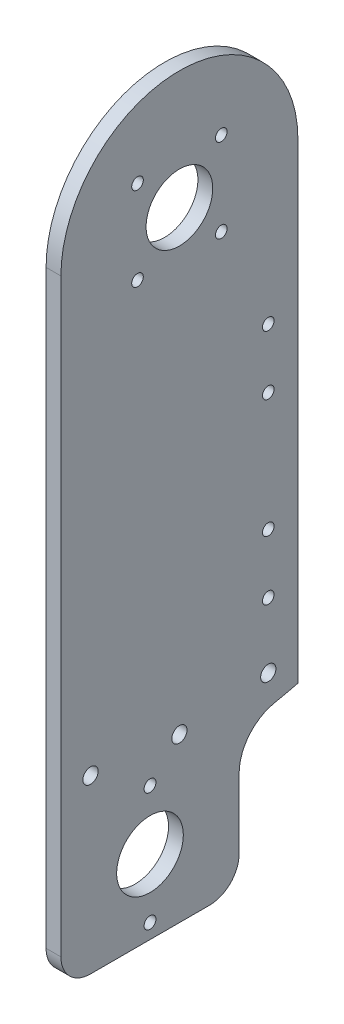
ISO-10303-21;
HEADER;
FILE_DESCRIPTION(('STEP AP214'),'2;1');
FILE_NAME('part.step','',(''),(''),'','','');
FILE_SCHEMA(('AUTOMOTIVE_DESIGN { 1 0 10303 214 1 1 1 1 }'));
ENDSEC;
DATA;
#1=APPLICATION_CONTEXT('core data for automotive mechanical design processes');
#2=APPLICATION_PROTOCOL_DEFINITION('international standard','automotive_design',2000,#1);
#3=PRODUCT_CONTEXT('',#1,'mechanical');
#4=PRODUCT('Part','Part','',(#3));
#5=PRODUCT_RELATED_PRODUCT_CATEGORY('part','',(#4));
#6=PRODUCT_DEFINITION_FORMATION('','',#4);
#7=PRODUCT_DEFINITION_CONTEXT('part definition',#1,'design');
#8=PRODUCT_DEFINITION('design','',#6,#7);
#9=PRODUCT_DEFINITION_SHAPE('','',#8);
#10=(LENGTH_UNIT() NAMED_UNIT(*) SI_UNIT(.MILLI.,.METRE.));
#11=(NAMED_UNIT(*) PLANE_ANGLE_UNIT() SI_UNIT($,.RADIAN.));
#12=(NAMED_UNIT(*) SI_UNIT($,.STERADIAN.) SOLID_ANGLE_UNIT());
#13=UNCERTAINTY_MEASURE_WITH_UNIT(LENGTH_MEASURE(1.E-05),#10,'distance_accuracy_value','');
#14=(GEOMETRIC_REPRESENTATION_CONTEXT(3) GLOBAL_UNCERTAINTY_ASSIGNED_CONTEXT((#13)) GLOBAL_UNIT_ASSIGNED_CONTEXT((#10,
#11,#12)) REPRESENTATION_CONTEXT('',''));
#15=CARTESIAN_POINT('',(0.,0.,0.));
#16=DIRECTION('',(0.,0.,1.));
#17=DIRECTION('',(1.,0.,0.));
#18=AXIS2_PLACEMENT_3D('',#15,#16,#17);
#19=CARTESIAN_POINT('',(0.,0.,0.));
#20=DIRECTION('',(-1.,0.,0.));
#21=DIRECTION('',(0.,0.,1.));
#22=AXIS2_PLACEMENT_3D('',#19,#20,#21);
#23=PLANE('',#22);
#24=CARTESIAN_POINT('',(0.,-17.9605122421383,17.9605122421383));
#25=DIRECTION('',(1.,0.,0.));
#26=DIRECTION('',(0.,0.,-1.));
#27=AXIS2_PLACEMENT_3D('',#24,#25,#26);
#28=CIRCLE('',#27,2.48919999999999);
#29=CARTESIAN_POINT('',(0.,-17.9605122421383,15.4713122421383));
#30=VERTEX_POINT('',#29);
#31=EDGE_CURVE('E306',#30,#30,#28,.T.);
#32=ORIENTED_EDGE('',*,*,#31,.T.);
#33=EDGE_LOOP('',(#32));
#34=FACE_BOUND('',#33,.T.);
#35=CARTESIAN_POINT('',(0.,17.9605122421383,17.9605122421383));
#36=DIRECTION('',(1.,0.,0.));
#37=DIRECTION('',(0.,0.,-1.));
#38=AXIS2_PLACEMENT_3D('',#35,#36,#37);
#39=CIRCLE('',#38,2.48919999999999);
#40=CARTESIAN_POINT('',(0.,17.9605122421383,15.4713122421383));
#41=VERTEX_POINT('',#40);
#42=EDGE_CURVE('E300',#41,#41,#39,.T.);
#43=ORIENTED_EDGE('',*,*,#42,.T.);
#44=EDGE_LOOP('',(#43));
#45=FACE_BOUND('',#44,.T.);
#46=CARTESIAN_POINT('',(0.,-233.739896777041,12.6030145186586));
#47=DIRECTION('',(1.,0.,0.));
#48=DIRECTION('',(0.,0.,-1.));
#49=AXIS2_PLACEMENT_3D('',#46,#47,#48);
#50=CIRCLE('',#49,14.2875);
#51=CARTESIAN_POINT('',(0.,-233.739896777041,-1.68448548134139));
#52=VERTEX_POINT('',#51);
#53=EDGE_CURVE('E217',#52,#52,#50,.T.);
#54=ORIENTED_EDGE('',*,*,#53,.T.);
#55=EDGE_LOOP('',(#54));
#56=FACE_BOUND('',#55,.T.);
#57=DIRECTION('',(0.,1.,0.));
#58=VECTOR('',#57,1.);
#59=CARTESIAN_POINT('',(0.,-265.489896777041,-25.5939709626856));
#60=LINE('',#59,#58);
#61=CARTESIAN_POINT('',(0.,-252.789896777041,-25.5939709626856));
#62=VERTEX_POINT('',#61);
#63=CARTESIAN_POINT('',(0.,-222.903218363224,-25.5939709626855));
#64=VERTEX_POINT('',#63);
#65=EDGE_CURVE('E183',#62,#64,#60,.T.);
#66=ORIENTED_EDGE('',*,*,#65,.F.);
#67=CARTESIAN_POINT('',(0.,-252.789896777041,-12.8939709626856));
#68=DIRECTION('',(-1.,0.,0.));
#69=DIRECTION('',(0.,0.,1.));
#70=AXIS2_PLACEMENT_3D('',#67,#68,#69);
#71=CIRCLE('',#70,12.7);
#72=CARTESIAN_POINT('',(0.,-265.489896777041,-12.8939709626856));
#73=VERTEX_POINT('',#72);
#74=EDGE_CURVE('E157',#62,#73,#71,.T.);
#75=ORIENTED_EDGE('',*,*,#74,.T.);
#76=DIRECTION('',(0.,0.,-1.));
#77=VECTOR('',#76,1.);
#78=CARTESIAN_POINT('',(0.,-265.489896777041,50.8000000000028));
#79=LINE('',#78,#77);
#80=CARTESIAN_POINT('',(0.,-265.489896777041,38.1000000000034));
#81=VERTEX_POINT('',#80);
#82=EDGE_CURVE('E186',#81,#73,#79,.T.);
#83=ORIENTED_EDGE('',*,*,#82,.F.);
#84=CARTESIAN_POINT('',(0.,-252.789896777041,38.1000000000034));
#85=DIRECTION('',(-1.,0.,0.));
#86=DIRECTION('',(0.,0.,1.));
#87=AXIS2_PLACEMENT_3D('',#84,#85,#86);
#88=CIRCLE('',#87,12.7);
#89=CARTESIAN_POINT('',(0.,-252.789896777042,50.8000000000034));
#90=VERTEX_POINT('',#89);
#91=EDGE_CURVE('E149',#81,#90,#88,.T.);
#92=ORIENTED_EDGE('',*,*,#91,.T.);
#93=DIRECTION('',(0.,-1.,0.));
#94=VECTOR('',#93,1.);
#95=CARTESIAN_POINT('',(0.,-201.98989677704,50.8000000000057));
#96=LINE('',#95,#94);
#97=CARTESIAN_POINT('',(0.,0.,50.8));
#98=VERTEX_POINT('',#97);
#99=EDGE_CURVE('E195',#98,#90,#96,.T.);
#100=ORIENTED_EDGE('',*,*,#99,.F.);
#101=CARTESIAN_POINT('',(0.,0.,0.));
#102=DIRECTION('',(1.,0.,0.));
#103=DIRECTION('',(0.,0.,1.));
#104=AXIS2_PLACEMENT_3D('',#101,#102,#103);
#105=CIRCLE('',#104,50.8);
#106=CARTESIAN_POINT('',(0.,0.,-50.8));
#107=VERTEX_POINT('',#106);
#108=EDGE_CURVE('E144',#107,#98,#105,.T.);
#109=ORIENTED_EDGE('',*,*,#108,.F.);
#110=DIRECTION('',(0.,1.,0.));
#111=VECTOR('',#110,1.);
#112=CARTESIAN_POINT('',(0.,0.,-50.8));
#113=LINE('',#112,#111);
#114=CARTESIAN_POINT('',(0.,-201.989896777042,-50.8));
#115=VERTEX_POINT('',#114);
#116=EDGE_CURVE('E140',#115,#107,#113,.T.);
#117=ORIENTED_EDGE('',*,*,#116,.F.);
#118=CARTESIAN_POINT('',(0.,0.,0.));
#119=DIRECTION('',(1.,0.,0.));
#120=DIRECTION('',(0.,0.,-1.));
#121=AXIS2_PLACEMENT_3D('',#118,#119,#120);
#122=CIRCLE('',#121,208.28);
#123=CARTESIAN_POINT('',(0.,-204.224177718261,-40.9028560775443));
#124=VERTEX_POINT('',#123);
#125=EDGE_CURVE('E177',#124,#115,#122,.T.);
#126=ORIENTED_EDGE('',*,*,#125,.F.);
#127=CARTESIAN_POINT('',(0.,-222.903218363224,-44.6439709626855));
#128=DIRECTION('',(-1.,0.,0.));
#129=DIRECTION('',(0.,0.,1.));
#130=AXIS2_PLACEMENT_3D('',#127,#128,#129);
#131=CIRCLE('',#130,19.05);
#132=EDGE_CURVE('E54',#124,#64,#131,.F.);
#133=ORIENTED_EDGE('',*,*,#132,.T.);
#134=EDGE_LOOP('',(#66,#75,#83,#92,#100,#109,#117,#126,#133));
#135=FACE_BOUND('',#134,.T.);
#136=CARTESIAN_POINT('',(0.,0.,0.));
#137=DIRECTION('',(1.,0.,0.));
#138=DIRECTION('',(0.,0.,-1.));
#139=AXIS2_PLACEMENT_3D('',#136,#137,#138);
#140=CIRCLE('',#139,14.2875);
#141=CARTESIAN_POINT('',(0.,0.,-14.2875));
#142=VERTEX_POINT('',#141);
#143=EDGE_CURVE('E211',#142,#142,#140,.T.);
#144=ORIENTED_EDGE('',*,*,#143,.T.);
#145=EDGE_LOOP('',(#144));
#146=FACE_BOUND('',#145,.T.);
#147=CARTESIAN_POINT('',(0.,-191.833069099151,38.1000000000027));
#148=DIRECTION('',(1.,0.,0.));
#149=DIRECTION('',(0.,0.,-1.));
#150=AXIS2_PLACEMENT_3D('',#147,#148,#149);
#151=CIRCLE('',#150,3.26389999999999);
#152=CARTESIAN_POINT('',(0.,-191.833069099151,34.8361000000027));
#153=VERTEX_POINT('',#152);
#154=EDGE_CURVE('E220',#153,#153,#151,.T.);
#155=ORIENTED_EDGE('',*,*,#154,.T.);
#156=EDGE_LOOP('',(#155));
#157=FACE_BOUND('',#156,.T.);
#158=CARTESIAN_POINT('',(0.,-195.58,1.36443570224712E-12));
#159=DIRECTION('',(1.,0.,0.));
#160=DIRECTION('',(0.,0.,-1.));
#161=AXIS2_PLACEMENT_3D('',#158,#159,#160);
#162=CIRCLE('',#161,3.26389999999999);
#163=CARTESIAN_POINT('',(0.,-195.58,-3.26389999999862));
#164=VERTEX_POINT('',#163);
#165=EDGE_CURVE('E228',#164,#164,#162,.T.);
#166=ORIENTED_EDGE('',*,*,#165,.T.);
#167=EDGE_LOOP('',(#166));
#168=FACE_BOUND('',#167,.T.);
#169=CARTESIAN_POINT('',(0.,-191.833069099152,-38.1000000000002));
#170=DIRECTION('',(1.,0.,0.));
#171=DIRECTION('',(0.,0.,-1.));
#172=AXIS2_PLACEMENT_3D('',#169,#170,#171);
#173=CIRCLE('',#172,3.26389999999999);
#174=CARTESIAN_POINT('',(0.,-191.833069099152,-41.3639000000001));
#175=VERTEX_POINT('',#174);
#176=EDGE_CURVE('E234',#175,#175,#173,.T.);
#177=ORIENTED_EDGE('',*,*,#176,.T.);
#178=EDGE_LOOP('',(#177));
#179=FACE_BOUND('',#178,.T.);
#180=CARTESIAN_POINT('',(0.,-208.339896777041,12.6030145186586));
#181=DIRECTION('',(1.,0.,0.));
#182=DIRECTION('',(0.,0.,-1.));
#183=AXIS2_PLACEMENT_3D('',#180,#181,#182);
#184=CIRCLE('',#183,2.53999999999999);
#185=CARTESIAN_POINT('',(0.,-208.339896777041,10.0630145186586));
#186=VERTEX_POINT('',#185);
#187=EDGE_CURVE('E240',#186,#186,#184,.T.);
#188=ORIENTED_EDGE('',*,*,#187,.T.);
#189=EDGE_LOOP('',(#188));
#190=FACE_BOUND('',#189,.T.);
#191=CARTESIAN_POINT('',(0.,-259.139896777041,12.6030145186586));
#192=DIRECTION('',(1.,0.,0.));
#193=DIRECTION('',(0.,0.,-1.));
#194=AXIS2_PLACEMENT_3D('',#191,#192,#193);
#195=CIRCLE('',#194,2.53999999999999);
#196=CARTESIAN_POINT('',(0.,-259.139896777041,10.0630145186586));
#197=VERTEX_POINT('',#196);
#198=EDGE_CURVE('E246',#197,#197,#195,.T.);
#199=ORIENTED_EDGE('',*,*,#198,.T.);
#200=EDGE_LOOP('',(#199));
#201=FACE_BOUND('',#200,.T.);
#202=CARTESIAN_POINT('',(0.,-62.2898967770419,-38.1));
#203=DIRECTION('',(1.,0.,0.));
#204=DIRECTION('',(0.,0.,-1.));
#205=AXIS2_PLACEMENT_3D('',#202,#203,#204);
#206=CIRCLE('',#205,4.7625);
#207=CARTESIAN_POINT('',(0.,-62.2898967770419,-42.8625));
#208=VERTEX_POINT('',#207);
#209=EDGE_CURVE('E258',#208,#208,#206,.T.);
#210=ORIENTED_EDGE('',*,*,#209,.T.);
#211=EDGE_LOOP('',(#210));
#212=FACE_BOUND('',#211,.T.);
#213=CARTESIAN_POINT('',(0.,-87.6898967770419,-38.1));
#214=DIRECTION('',(1.,0.,0.));
#215=DIRECTION('',(0.,0.,-1.));
#216=AXIS2_PLACEMENT_3D('',#213,#214,#215);
#217=CIRCLE('',#216,4.7625);
#218=CARTESIAN_POINT('',(0.,-87.6898967770419,-42.8625));
#219=VERTEX_POINT('',#218);
#220=EDGE_CURVE('E267',#219,#219,#217,.T.);
#221=ORIENTED_EDGE('',*,*,#220,.T.);
#222=EDGE_LOOP('',(#221));
#223=FACE_BOUND('',#222,.T.);
#224=CARTESIAN_POINT('',(0.,-138.489896777042,-38.1));
#225=DIRECTION('',(1.,0.,0.));
#226=DIRECTION('',(0.,0.,-1.));
#227=AXIS2_PLACEMENT_3D('',#224,#225,#226);
#228=CIRCLE('',#227,4.7625);
#229=CARTESIAN_POINT('',(0.,-138.489896777042,-42.8625));
#230=VERTEX_POINT('',#229);
#231=EDGE_CURVE('E276',#230,#230,#228,.T.);
#232=ORIENTED_EDGE('',*,*,#231,.T.);
#233=EDGE_LOOP('',(#232));
#234=FACE_BOUND('',#233,.T.);
#235=CARTESIAN_POINT('',(0.,-163.889896777042,-38.1));
#236=DIRECTION('',(1.,0.,0.));
#237=DIRECTION('',(0.,0.,-1.));
#238=AXIS2_PLACEMENT_3D('',#235,#236,#237);
#239=CIRCLE('',#238,4.7625);
#240=CARTESIAN_POINT('',(0.,-163.889896777042,-42.8625));
#241=VERTEX_POINT('',#240);
#242=EDGE_CURVE('E285',#241,#241,#239,.T.);
#243=ORIENTED_EDGE('',*,*,#242,.T.);
#244=EDGE_LOOP('',(#243));
#245=FACE_BOUND('',#244,.T.);
#246=CARTESIAN_POINT('',(0.,-17.9605122421383,-17.9605122421383));
#247=DIRECTION('',(1.,0.,0.));
#248=DIRECTION('',(0.,0.,-1.));
#249=AXIS2_PLACEMENT_3D('',#246,#247,#248);
#250=CIRCLE('',#249,2.48919999999999);
#251=CARTESIAN_POINT('',(0.,-17.9605122421383,-20.4497122421383));
#252=VERTEX_POINT('',#251);
#253=EDGE_CURVE('E288',#252,#252,#250,.T.);
#254=ORIENTED_EDGE('',*,*,#253,.T.);
#255=EDGE_LOOP('',(#254));
#256=FACE_BOUND('',#255,.T.);
#257=CARTESIAN_POINT('',(0.,17.9605122421383,-17.9605122421383));
#258=DIRECTION('',(1.,0.,0.));
#259=DIRECTION('',(0.,0.,-1.));
#260=AXIS2_PLACEMENT_3D('',#257,#258,#259);
#261=CIRCLE('',#260,2.48919999999999);
#262=CARTESIAN_POINT('',(0.,17.9605122421383,-20.4497122421383));
#263=VERTEX_POINT('',#262);
#264=EDGE_CURVE('E294',#263,#263,#261,.T.);
#265=ORIENTED_EDGE('',*,*,#264,.T.);
#266=EDGE_LOOP('',(#265));
#267=FACE_BOUND('',#266,.T.);
#268=ADVANCED_FACE('F46',(#34,#45,#56,#135,#146,#157,#168,#179,#190,#201,#212,#223,#234,#245,
#256,#267),#23,.T.);
#269=CARTESIAN_POINT('',(6.35,0.,0.));
#270=DIRECTION('',(-1.,0.,0.));
#271=DIRECTION('',(0.,0.,1.));
#272=AXIS2_PLACEMENT_3D('',#269,#270,#271);
#273=PLANE('',#272);
#274=CARTESIAN_POINT('',(6.35,-17.9605122421383,17.9605122421383));
#275=DIRECTION('',(1.,0.,0.));
#276=DIRECTION('',(0.,0.,-1.));
#277=AXIS2_PLACEMENT_3D('',#274,#275,#276);
#278=CIRCLE('',#277,2.48919999999999);
#279=CARTESIAN_POINT('',(6.35,-17.9605122421383,15.4713122421383));
#280=VERTEX_POINT('',#279);
#281=EDGE_CURVE('E309',#280,#280,#278,.T.);
#282=ORIENTED_EDGE('',*,*,#281,.F.);
#283=EDGE_LOOP('',(#282));
#284=FACE_BOUND('',#283,.T.);
#285=CARTESIAN_POINT('',(6.35,17.9605122421383,17.9605122421383));
#286=DIRECTION('',(1.,0.,0.));
#287=DIRECTION('',(0.,0.,-1.));
#288=AXIS2_PLACEMENT_3D('',#285,#286,#287);
#289=CIRCLE('',#288,2.48919999999999);
#290=CARTESIAN_POINT('',(6.35,17.9605122421383,15.4713122421383));
#291=VERTEX_POINT('',#290);
#292=EDGE_CURVE('E303',#291,#291,#289,.T.);
#293=ORIENTED_EDGE('',*,*,#292,.F.);
#294=EDGE_LOOP('',(#293));
#295=FACE_BOUND('',#294,.T.);
#296=CARTESIAN_POINT('',(6.35,17.9605122421383,-17.9605122421383));
#297=DIRECTION('',(1.,0.,0.));
#298=DIRECTION('',(0.,0.,-1.));
#299=AXIS2_PLACEMENT_3D('',#296,#297,#298);
#300=CIRCLE('',#299,2.48919999999999);
#301=CARTESIAN_POINT('',(6.35,17.9605122421383,-20.4497122421383));
#302=VERTEX_POINT('',#301);
#303=EDGE_CURVE('E297',#302,#302,#300,.T.);
#304=ORIENTED_EDGE('',*,*,#303,.F.);
#305=EDGE_LOOP('',(#304));
#306=FACE_BOUND('',#305,.T.);
#307=CARTESIAN_POINT('',(6.35,-17.9605122421383,-17.9605122421383));
#308=DIRECTION('',(1.,0.,0.));
#309=DIRECTION('',(0.,0.,-1.));
#310=AXIS2_PLACEMENT_3D('',#307,#308,#309);
#311=CIRCLE('',#310,2.48919999999999);
#312=CARTESIAN_POINT('',(6.35,-17.9605122421383,-20.4497122421383));
#313=VERTEX_POINT('',#312);
#314=EDGE_CURVE('E291',#313,#313,#311,.T.);
#315=ORIENTED_EDGE('',*,*,#314,.F.);
#316=EDGE_LOOP('',(#315));
#317=FACE_BOUND('',#316,.T.);
#318=CARTESIAN_POINT('',(6.35,-138.489896777042,-38.1));
#319=DIRECTION('',(1.,0.,0.));
#320=DIRECTION('',(0.,0.,-1.));
#321=AXIS2_PLACEMENT_3D('',#318,#319,#320);
#322=CIRCLE('',#321,2.4892);
#323=CARTESIAN_POINT('',(6.35,-138.489896777042,-40.5892));
#324=VERTEX_POINT('',#323);
#325=EDGE_CURVE('E273',#324,#324,#322,.T.);
#326=ORIENTED_EDGE('',*,*,#325,.F.);
#327=EDGE_LOOP('',(#326));
#328=FACE_BOUND('',#327,.T.);
#329=CARTESIAN_POINT('',(6.35,-87.6898967770419,-38.1));
#330=DIRECTION('',(1.,0.,0.));
#331=DIRECTION('',(0.,0.,-1.));
#332=AXIS2_PLACEMENT_3D('',#329,#330,#331);
#333=CIRCLE('',#332,2.48919999999998);
#334=CARTESIAN_POINT('',(6.35,-87.6898967770419,-40.5892));
#335=VERTEX_POINT('',#334);
#336=EDGE_CURVE('E264',#335,#335,#333,.T.);
#337=ORIENTED_EDGE('',*,*,#336,.F.);
#338=EDGE_LOOP('',(#337));
#339=FACE_BOUND('',#338,.T.);
#340=CARTESIAN_POINT('',(6.35,-62.2898967770419,-38.1));
#341=DIRECTION('',(1.,0.,0.));
#342=DIRECTION('',(0.,0.,-1.));
#343=AXIS2_PLACEMENT_3D('',#340,#341,#342);
#344=CIRCLE('',#343,2.48919999999999);
#345=CARTESIAN_POINT('',(6.35,-62.2898967770419,-40.5892));
#346=VERTEX_POINT('',#345);
#347=EDGE_CURVE('E255',#346,#346,#344,.T.);
#348=ORIENTED_EDGE('',*,*,#347,.F.);
#349=EDGE_LOOP('',(#348));
#350=FACE_BOUND('',#349,.T.);
#351=CARTESIAN_POINT('',(6.35,-259.139896777041,12.6030145186586));
#352=DIRECTION('',(1.,0.,0.));
#353=DIRECTION('',(0.,0.,-1.));
#354=AXIS2_PLACEMENT_3D('',#351,#352,#353);
#355=CIRCLE('',#354,2.53999999999999);
#356=CARTESIAN_POINT('',(6.35,-259.139896777041,10.0630145186586));
#357=VERTEX_POINT('',#356);
#358=EDGE_CURVE('E249',#357,#357,#355,.T.);
#359=ORIENTED_EDGE('',*,*,#358,.F.);
#360=EDGE_LOOP('',(#359));
#361=FACE_BOUND('',#360,.T.);
#362=CARTESIAN_POINT('',(6.35,-208.339896777041,12.6030145186586));
#363=DIRECTION('',(1.,0.,0.));
#364=DIRECTION('',(0.,0.,-1.));
#365=AXIS2_PLACEMENT_3D('',#362,#363,#364);
#366=CIRCLE('',#365,2.53999999999999);
#367=CARTESIAN_POINT('',(6.35,-208.339896777041,10.0630145186586));
#368=VERTEX_POINT('',#367);
#369=EDGE_CURVE('E243',#368,#368,#366,.T.);
#370=ORIENTED_EDGE('',*,*,#369,.F.);
#371=EDGE_LOOP('',(#370));
#372=FACE_BOUND('',#371,.T.);
#373=CARTESIAN_POINT('',(6.35,-191.833069099152,-38.1000000000002));
#374=DIRECTION('',(1.,0.,0.));
#375=DIRECTION('',(0.,0.,-1.));
#376=AXIS2_PLACEMENT_3D('',#373,#374,#375);
#377=CIRCLE('',#376,3.26389999999999);
#378=CARTESIAN_POINT('',(6.35,-191.833069099152,-41.3639000000001));
#379=VERTEX_POINT('',#378);
#380=EDGE_CURVE('E237',#379,#379,#377,.T.);
#381=ORIENTED_EDGE('',*,*,#380,.F.);
#382=EDGE_LOOP('',(#381));
#383=FACE_BOUND('',#382,.T.);
#384=CARTESIAN_POINT('',(6.35,-195.58,1.36443570224712E-12));
#385=DIRECTION('',(1.,0.,0.));
#386=DIRECTION('',(0.,0.,-1.));
#387=AXIS2_PLACEMENT_3D('',#384,#385,#386);
#388=CIRCLE('',#387,3.26389999999999);
#389=CARTESIAN_POINT('',(6.35,-195.58,-3.26389999999862));
#390=VERTEX_POINT('',#389);
#391=EDGE_CURVE('E231',#390,#390,#388,.T.);
#392=ORIENTED_EDGE('',*,*,#391,.F.);
#393=EDGE_LOOP('',(#392));
#394=FACE_BOUND('',#393,.T.);
#395=CARTESIAN_POINT('',(6.35,-191.833069099151,38.1000000000027));
#396=DIRECTION('',(1.,0.,0.));
#397=DIRECTION('',(0.,0.,-1.));
#398=AXIS2_PLACEMENT_3D('',#395,#396,#397);
#399=CIRCLE('',#398,3.26389999999999);
#400=CARTESIAN_POINT('',(6.35,-191.833069099151,34.8361000000027));
#401=VERTEX_POINT('',#400);
#402=EDGE_CURVE('E225',#401,#401,#399,.T.);
#403=ORIENTED_EDGE('',*,*,#402,.F.);
#404=EDGE_LOOP('',(#403));
#405=FACE_BOUND('',#404,.T.);
#406=DIRECTION('',(0.,0.,-1.));
#407=VECTOR('',#406,1.);
#408=CARTESIAN_POINT('',(6.35,-265.489896777041,50.8000000000028));
#409=LINE('',#408,#407);
#410=CARTESIAN_POINT('',(6.35,-265.489896777041,38.1000000000034));
#411=VERTEX_POINT('',#410);
#412=CARTESIAN_POINT('',(6.35,-265.489896777041,-12.8939709626856));
#413=VERTEX_POINT('',#412);
#414=EDGE_CURVE('E128',#411,#413,#409,.T.);
#415=ORIENTED_EDGE('',*,*,#414,.T.);
#416=CARTESIAN_POINT('',(6.35,-252.789896777041,-12.8939709626856));
#417=DIRECTION('',(-1.,0.,0.));
#418=DIRECTION('',(0.,0.,1.));
#419=AXIS2_PLACEMENT_3D('',#416,#417,#418);
#420=CIRCLE('',#419,12.7);
#421=CARTESIAN_POINT('',(6.35,-252.789896777041,-25.5939709626856));
#422=VERTEX_POINT('',#421);
#423=EDGE_CURVE('E166',#413,#422,#420,.F.);
#424=ORIENTED_EDGE('',*,*,#423,.T.);
#425=DIRECTION('',(0.,1.,0.));
#426=VECTOR('',#425,1.);
#427=CARTESIAN_POINT('',(6.35,-265.489896777041,-25.5939709626856));
#428=LINE('',#427,#426);
#429=CARTESIAN_POINT('',(6.35,-222.903218363224,-25.5939709626855));
#430=VERTEX_POINT('',#429);
#431=EDGE_CURVE('E190',#422,#430,#428,.T.);
#432=ORIENTED_EDGE('',*,*,#431,.T.);
#433=CARTESIAN_POINT('',(6.35,-222.903218363224,-44.6439709626855));
#434=DIRECTION('',(-1.,0.,0.));
#435=DIRECTION('',(0.,0.,1.));
#436=AXIS2_PLACEMENT_3D('',#433,#434,#435);
#437=CIRCLE('',#436,19.05);
#438=CARTESIAN_POINT('',(6.35,-204.224177718261,-40.9028560775443));
#439=VERTEX_POINT('',#438);
#440=EDGE_CURVE('E11',#430,#439,#437,.T.);
#441=ORIENTED_EDGE('',*,*,#440,.T.);
#442=CARTESIAN_POINT('',(6.35,0.,0.));
#443=DIRECTION('',(1.,0.,0.));
#444=DIRECTION('',(0.,0.,-1.));
#445=AXIS2_PLACEMENT_3D('',#442,#443,#444);
#446=CIRCLE('',#445,208.28);
#447=CARTESIAN_POINT('',(6.35,-201.989896777042,-50.8));
#448=VERTEX_POINT('',#447);
#449=EDGE_CURVE('E178',#439,#448,#446,.T.);
#450=ORIENTED_EDGE('',*,*,#449,.T.);
#451=DIRECTION('',(0.,1.,0.));
#452=VECTOR('',#451,1.);
#453=CARTESIAN_POINT('',(6.35,0.,-50.8));
#454=LINE('',#453,#452);
#455=CARTESIAN_POINT('',(6.35,0.,-50.8));
#456=VERTEX_POINT('',#455);
#457=EDGE_CURVE('E136',#448,#456,#454,.T.);
#458=ORIENTED_EDGE('',*,*,#457,.T.);
#459=CARTESIAN_POINT('',(6.35,0.,0.));
#460=DIRECTION('',(1.,0.,0.));
#461=DIRECTION('',(0.,0.,1.));
#462=AXIS2_PLACEMENT_3D('',#459,#460,#461);
#463=CIRCLE('',#462,50.8);
#464=CARTESIAN_POINT('',(6.35,0.,50.8));
#465=VERTEX_POINT('',#464);
#466=EDGE_CURVE('E129',#456,#465,#463,.T.);
#467=ORIENTED_EDGE('',*,*,#466,.T.);
#468=DIRECTION('',(0.,-1.,0.));
#469=VECTOR('',#468,1.);
#470=CARTESIAN_POINT('',(6.35,0.,50.8));
#471=LINE('',#470,#469);
#472=CARTESIAN_POINT('',(6.35,-252.789896777042,50.8000000000071));
#473=VERTEX_POINT('',#472);
#474=EDGE_CURVE('E117',#465,#473,#471,.T.);
#475=ORIENTED_EDGE('',*,*,#474,.T.);
#476=CARTESIAN_POINT('',(6.35,-252.789896777041,38.1000000000034));
#477=DIRECTION('',(-1.,0.,0.));
#478=DIRECTION('',(0.,0.,1.));
#479=AXIS2_PLACEMENT_3D('',#476,#477,#478);
#480=CIRCLE('',#479,12.7);
#481=EDGE_CURVE('E164',#473,#411,#480,.F.);
#482=ORIENTED_EDGE('',*,*,#481,.T.);
#483=EDGE_LOOP('',(#415,#424,#432,#441,#450,#458,#467,#475,#482));
#484=FACE_BOUND('',#483,.T.);
#485=CARTESIAN_POINT('',(6.35,0.,0.));
#486=DIRECTION('',(1.,0.,0.));
#487=DIRECTION('',(0.,0.,-1.));
#488=AXIS2_PLACEMENT_3D('',#485,#486,#487);
#489=CIRCLE('',#488,14.2875);
#490=CARTESIAN_POINT('',(6.35,0.,-14.2875));
#491=VERTEX_POINT('',#490);
#492=EDGE_CURVE('E196',#491,#491,#489,.T.);
#493=ORIENTED_EDGE('',*,*,#492,.F.);
#494=EDGE_LOOP('',(#493));
#495=FACE_BOUND('',#494,.T.);
#496=CARTESIAN_POINT('',(6.35,-233.739896777041,12.6030145186586));
#497=DIRECTION('',(1.,0.,0.));
#498=DIRECTION('',(0.,0.,-1.));
#499=AXIS2_PLACEMENT_3D('',#496,#497,#498);
#500=CIRCLE('',#499,14.2875);
#501=CARTESIAN_POINT('',(6.35,-233.739896777041,-1.68448548134139));
#502=VERTEX_POINT('',#501);
#503=EDGE_CURVE('E214',#502,#502,#500,.T.);
#504=ORIENTED_EDGE('',*,*,#503,.F.);
#505=EDGE_LOOP('',(#504));
#506=FACE_BOUND('',#505,.T.);
#507=CARTESIAN_POINT('',(6.35,-163.889896777042,-38.1));
#508=DIRECTION('',(1.,0.,0.));
#509=DIRECTION('',(0.,0.,-1.));
#510=AXIS2_PLACEMENT_3D('',#507,#508,#509);
#511=CIRCLE('',#510,2.4892);
#512=CARTESIAN_POINT('',(6.35,-163.889896777042,-40.5892));
#513=VERTEX_POINT('',#512);
#514=EDGE_CURVE('E282',#513,#513,#511,.T.);
#515=ORIENTED_EDGE('',*,*,#514,.F.);
#516=EDGE_LOOP('',(#515));
#517=FACE_BOUND('',#516,.T.);
#518=ADVANCED_FACE('F133',(#284,#295,#306,#317,#328,#339,#350,#361,#372,#383,#394,#405,#484,
#495,#506,#517),#273,.F.);
#519=CARTESIAN_POINT('',(6.35,0.,0.));
#520=DIRECTION('',(-1.,0.,0.));
#521=DIRECTION('',(0.,0.,1.));
#522=AXIS2_PLACEMENT_3D('',#519,#520,#521);
#523=CYLINDRICAL_SURFACE('',#522,50.8);
#524=ORIENTED_EDGE('',*,*,#108,.T.);
#525=DIRECTION('',(-1.,0.,0.));
#526=VECTOR('',#525,1.);
#527=CARTESIAN_POINT('',(6.35,0.,50.8));
#528=LINE('',#527,#526);
#529=EDGE_CURVE('E122',#465,#98,#528,.T.);
#530=ORIENTED_EDGE('',*,*,#529,.F.);
#531=ORIENTED_EDGE('',*,*,#466,.F.);
#532=DIRECTION('',(-1.,0.,0.));
#533=VECTOR('',#532,1.);
#534=CARTESIAN_POINT('',(6.35,0.,-50.8));
#535=LINE('',#534,#533);
#536=EDGE_CURVE('E152',#456,#107,#535,.T.);
#537=ORIENTED_EDGE('',*,*,#536,.T.);
#538=EDGE_LOOP('',(#524,#530,#531,#537));
#539=FACE_BOUND('',#538,.T.);
#540=ADVANCED_FACE('F142',(#539),#523,.T.);
#541=CARTESIAN_POINT('',(6.35,-201.98989677704,50.8000000000057));
#542=DIRECTION('',(0.,0.,-1.));
#543=DIRECTION('',(0.,1.,0.));
#544=AXIS2_PLACEMENT_3D('',#541,#542,#543);
#545=PLANE('',#544);
#546=ORIENTED_EDGE('',*,*,#99,.T.);
#547=DIRECTION('',(-1.,0.,0.));
#548=VECTOR('',#547,1.);
#549=CARTESIAN_POINT('',(6.35,-252.789896777042,50.8000000000034));
#550=LINE('',#549,#548);
#551=EDGE_CURVE('E125',#90,#473,#550,.F.);
#552=ORIENTED_EDGE('',*,*,#551,.T.);
#553=ORIENTED_EDGE('',*,*,#474,.F.);
#554=ORIENTED_EDGE('',*,*,#529,.T.);
#555=EDGE_LOOP('',(#546,#552,#553,#554));
#556=FACE_BOUND('',#555,.T.);
#557=ADVANCED_FACE('F120',(#556),#545,.F.);
#558=CARTESIAN_POINT('',(6.35,-265.489896777041,50.8000000000028));
#559=DIRECTION('',(0.,1.,0.));
#560=DIRECTION('',(0.,0.,1.));
#561=AXIS2_PLACEMENT_3D('',#558,#559,#560);
#562=PLANE('',#561);
#563=ORIENTED_EDGE('',*,*,#82,.T.);
#564=DIRECTION('',(-1.,0.,0.));
#565=VECTOR('',#564,1.);
#566=CARTESIAN_POINT('',(6.35,-265.489896777041,-12.8939709626856));
#567=LINE('',#566,#565);
#568=EDGE_CURVE('E162',#73,#413,#567,.F.);
#569=ORIENTED_EDGE('',*,*,#568,.T.);
#570=ORIENTED_EDGE('',*,*,#414,.F.);
#571=DIRECTION('',(-1.,0.,0.));
#572=VECTOR('',#571,1.);
#573=CARTESIAN_POINT('',(6.35,-265.489896777041,38.1000000000034));
#574=LINE('',#573,#572);
#575=EDGE_CURVE('E159',#411,#81,#574,.T.);
#576=ORIENTED_EDGE('',*,*,#575,.T.);
#577=EDGE_LOOP('',(#563,#569,#570,#576));
#578=FACE_BOUND('',#577,.T.);
#579=ADVANCED_FACE('F201',(#578),#562,.F.);
#580=CARTESIAN_POINT('',(6.35,-265.489896777041,-25.5939709626856));
#581=DIRECTION('',(0.,0.,1.));
#582=DIRECTION('',(0.,-1.,0.));
#583=AXIS2_PLACEMENT_3D('',#580,#581,#582);
#584=PLANE('',#583);
#585=ORIENTED_EDGE('',*,*,#65,.T.);
#586=DIRECTION('',(1.,0.,0.));
#587=VECTOR('',#586,1.);
#588=CARTESIAN_POINT('',(6.35,-222.903218363224,-25.5939709626855));
#589=LINE('',#588,#587);
#590=EDGE_CURVE('E67',#64,#430,#589,.T.);
#591=ORIENTED_EDGE('',*,*,#590,.T.);
#592=ORIENTED_EDGE('',*,*,#431,.F.);
#593=DIRECTION('',(-1.,0.,0.));
#594=VECTOR('',#593,1.);
#595=CARTESIAN_POINT('',(6.35,-252.789896777041,-25.5939709626856));
#596=LINE('',#595,#594);
#597=EDGE_CURVE('E145',#422,#62,#596,.T.);
#598=ORIENTED_EDGE('',*,*,#597,.T.);
#599=EDGE_LOOP('',(#585,#591,#592,#598));
#600=FACE_BOUND('',#599,.T.);
#601=ADVANCED_FACE('F208',(#600),#584,.F.);
#602=CARTESIAN_POINT('',(6.35,0.,0.));
#603=DIRECTION('',(-1.,0.,0.));
#604=DIRECTION('',(0.,0.,1.));
#605=AXIS2_PLACEMENT_3D('',#602,#603,#604);
#606=CYLINDRICAL_SURFACE('',#605,208.28);
#607=ORIENTED_EDGE('',*,*,#449,.F.);
#608=DIRECTION('',(-1.,0.,0.));
#609=VECTOR('',#608,1.);
#610=CARTESIAN_POINT('',(6.35,-204.224177718261,-40.9028560775443));
#611=LINE('',#610,#609);
#612=EDGE_CURVE('E169',#439,#124,#611,.T.);
#613=ORIENTED_EDGE('',*,*,#612,.T.);
#614=ORIENTED_EDGE('',*,*,#125,.T.);
#615=DIRECTION('',(-1.,0.,0.));
#616=VECTOR('',#615,1.);
#617=CARTESIAN_POINT('',(6.35,-201.989896777042,-50.8));
#618=LINE('',#617,#616);
#619=EDGE_CURVE('E146',#448,#115,#618,.T.);
#620=ORIENTED_EDGE('',*,*,#619,.F.);
#621=EDGE_LOOP('',(#607,#613,#614,#620));
#622=FACE_BOUND('',#621,.T.);
#623=ADVANCED_FACE('F175',(#622),#606,.T.);
#624=CARTESIAN_POINT('',(6.35,0.,-50.8));
#625=DIRECTION('',(0.,0.,1.));
#626=DIRECTION('',(0.,-1.,0.));
#627=AXIS2_PLACEMENT_3D('',#624,#625,#626);
#628=PLANE('',#627);
#629=ORIENTED_EDGE('',*,*,#116,.T.);
#630=ORIENTED_EDGE('',*,*,#536,.F.);
#631=ORIENTED_EDGE('',*,*,#457,.F.);
#632=ORIENTED_EDGE('',*,*,#619,.T.);
#633=EDGE_LOOP('',(#629,#630,#631,#632));
#634=FACE_BOUND('',#633,.T.);
#635=ADVANCED_FACE('F366',(#634),#628,.F.);
#636=CARTESIAN_POINT('',(6.35,0.,0.));
#637=DIRECTION('',(-1.,0.,0.));
#638=DIRECTION('',(0.,0.,1.));
#639=AXIS2_PLACEMENT_3D('',#636,#637,#638);
#640=CYLINDRICAL_SURFACE('',#639,14.2875);
#641=ORIENTED_EDGE('',*,*,#492,.T.);
#642=EDGE_LOOP('',(#641));
#643=FACE_BOUND('',#642,.T.);
#644=ORIENTED_EDGE('',*,*,#143,.F.);
#645=EDGE_LOOP('',(#644));
#646=FACE_BOUND('',#645,.T.);
#647=ADVANCED_FACE('F353',(#643,#646),#640,.F.);
#648=CARTESIAN_POINT('',(6.35,-233.739896777041,12.6030145186586));
#649=DIRECTION('',(-1.,0.,0.));
#650=DIRECTION('',(0.,0.,1.));
#651=AXIS2_PLACEMENT_3D('',#648,#649,#650);
#652=CYLINDRICAL_SURFACE('',#651,14.2875);
#653=ORIENTED_EDGE('',*,*,#503,.T.);
#654=EDGE_LOOP('',(#653));
#655=FACE_BOUND('',#654,.T.);
#656=ORIENTED_EDGE('',*,*,#53,.F.);
#657=EDGE_LOOP('',(#656));
#658=FACE_BOUND('',#657,.T.);
#659=ADVANCED_FACE('F343',(#655,#658),#652,.F.);
#660=CARTESIAN_POINT('',(6.35,-191.833069099151,38.1000000000027));
#661=DIRECTION('',(1.,0.,0.));
#662=DIRECTION('',(0.,0.,-1.));
#663=AXIS2_PLACEMENT_3D('',#660,#661,#662);
#664=CYLINDRICAL_SURFACE('',#663,3.26389999999999);
#665=ORIENTED_EDGE('',*,*,#154,.F.);
#666=EDGE_LOOP('',(#665));
#667=FACE_BOUND('',#666,.T.);
#668=ORIENTED_EDGE('',*,*,#402,.T.);
#669=EDGE_LOOP('',(#668));
#670=FACE_BOUND('',#669,.T.);
#671=ADVANCED_FACE('F340',(#667,#670),#664,.F.);
#672=CARTESIAN_POINT('',(6.35,-195.58,1.36443570224712E-12));
#673=DIRECTION('',(1.,0.,0.));
#674=DIRECTION('',(0.,0.,-1.));
#675=AXIS2_PLACEMENT_3D('',#672,#673,#674);
#676=CYLINDRICAL_SURFACE('',#675,3.26389999999999);
#677=ORIENTED_EDGE('',*,*,#165,.F.);
#678=EDGE_LOOP('',(#677));
#679=FACE_BOUND('',#678,.T.);
#680=ORIENTED_EDGE('',*,*,#391,.T.);
#681=EDGE_LOOP('',(#680));
#682=FACE_BOUND('',#681,.T.);
#683=ADVANCED_FACE('F342',(#679,#682),#676,.F.);
#684=CARTESIAN_POINT('',(6.35,-191.833069099152,-38.1000000000002));
#685=DIRECTION('',(1.,0.,0.));
#686=DIRECTION('',(0.,0.,-1.));
#687=AXIS2_PLACEMENT_3D('',#684,#685,#686);
#688=CYLINDRICAL_SURFACE('',#687,3.26389999999999);
#689=ORIENTED_EDGE('',*,*,#176,.F.);
#690=EDGE_LOOP('',(#689));
#691=FACE_BOUND('',#690,.T.);
#692=ORIENTED_EDGE('',*,*,#380,.T.);
#693=EDGE_LOOP('',(#692));
#694=FACE_BOUND('',#693,.T.);
#695=ADVANCED_FACE('F350',(#691,#694),#688,.F.);
#696=CARTESIAN_POINT('',(6.35,-208.339896777041,12.6030145186586));
#697=DIRECTION('',(1.,0.,0.));
#698=DIRECTION('',(0.,0.,-1.));
#699=AXIS2_PLACEMENT_3D('',#696,#697,#698);
#700=CYLINDRICAL_SURFACE('',#699,2.53999999999999);
#701=ORIENTED_EDGE('',*,*,#187,.F.);
#702=EDGE_LOOP('',(#701));
#703=FACE_BOUND('',#702,.T.);
#704=ORIENTED_EDGE('',*,*,#369,.T.);
#705=EDGE_LOOP('',(#704));
#706=FACE_BOUND('',#705,.T.);
#707=ADVANCED_FACE('F407',(#703,#706),#700,.F.);
#708=CARTESIAN_POINT('',(6.35,-259.139896777041,12.6030145186586));
#709=DIRECTION('',(1.,0.,0.));
#710=DIRECTION('',(0.,0.,-1.));
#711=AXIS2_PLACEMENT_3D('',#708,#709,#710);
#712=CYLINDRICAL_SURFACE('',#711,2.53999999999999);
#713=ORIENTED_EDGE('',*,*,#198,.F.);
#714=EDGE_LOOP('',(#713));
#715=FACE_BOUND('',#714,.T.);
#716=ORIENTED_EDGE('',*,*,#358,.T.);
#717=EDGE_LOOP('',(#716));
#718=FACE_BOUND('',#717,.T.);
#719=ADVANCED_FACE('F382',(#715,#718),#712,.F.);
#720=CARTESIAN_POINT('',(6.35,-252.789896777041,-12.8939709626856));
#721=DIRECTION('',(-1.,0.,0.));
#722=DIRECTION('',(0.,0.,1.));
#723=AXIS2_PLACEMENT_3D('',#720,#721,#722);
#724=CYLINDRICAL_SURFACE('',#723,12.7);
#725=ORIENTED_EDGE('',*,*,#423,.F.);
#726=ORIENTED_EDGE('',*,*,#568,.F.);
#727=ORIENTED_EDGE('',*,*,#74,.F.);
#728=ORIENTED_EDGE('',*,*,#597,.F.);
#729=EDGE_LOOP('',(#725,#726,#727,#728));
#730=FACE_BOUND('',#729,.T.);
#731=ADVANCED_FACE('F206',(#730),#724,.T.);
#732=CARTESIAN_POINT('',(6.35,-252.789896777041,38.1000000000034));
#733=DIRECTION('',(-1.,0.,0.));
#734=DIRECTION('',(0.,0.,1.));
#735=AXIS2_PLACEMENT_3D('',#732,#733,#734);
#736=CYLINDRICAL_SURFACE('',#735,12.7);
#737=ORIENTED_EDGE('',*,*,#481,.F.);
#738=ORIENTED_EDGE('',*,*,#551,.F.);
#739=ORIENTED_EDGE('',*,*,#91,.F.);
#740=ORIENTED_EDGE('',*,*,#575,.F.);
#741=EDGE_LOOP('',(#737,#738,#739,#740));
#742=FACE_BOUND('',#741,.T.);
#743=ADVANCED_FACE('F381',(#742),#736,.T.);
#744=CARTESIAN_POINT('',(6.35,-222.903218363224,-44.6439709626855));
#745=DIRECTION('',(-1.,0.,0.));
#746=DIRECTION('',(0.,0.,1.));
#747=AXIS2_PLACEMENT_3D('',#744,#745,#746);
#748=CYLINDRICAL_SURFACE('',#747,19.05);
#749=ORIENTED_EDGE('',*,*,#440,.F.);
#750=ORIENTED_EDGE('',*,*,#590,.F.);
#751=ORIENTED_EDGE('',*,*,#132,.F.);
#752=ORIENTED_EDGE('',*,*,#612,.F.);
#753=EDGE_LOOP('',(#749,#750,#751,#752));
#754=FACE_BOUND('',#753,.T.);
#755=ADVANCED_FACE('F48',(#754),#748,.F.);
#756=CARTESIAN_POINT('',(2.2733,-62.2898967770419,-38.1));
#757=DIRECTION('',(-1.,0.,0.));
#758=DIRECTION('',(0.,0.,1.));
#759=AXIS2_PLACEMENT_3D('',#756,#757,#758);
#760=CONICAL_SURFACE('',#759,2.4892,0.785398163397448);
#761=ORIENTED_EDGE('',*,*,#209,.F.);
#762=EDGE_LOOP('',(#761));
#763=FACE_BOUND('',#762,.T.);
#764=CARTESIAN_POINT('',(2.2733,-62.2898967770419,-38.1));
#765=DIRECTION('',(1.,0.,0.));
#766=DIRECTION('',(0.,0.,-1.));
#767=AXIS2_PLACEMENT_3D('',#764,#765,#766);
#768=CIRCLE('',#767,2.4892);
#769=CARTESIAN_POINT('',(2.2733,-62.2898967770419,-40.5892));
#770=VERTEX_POINT('',#769);
#771=EDGE_CURVE('E252',#770,#770,#768,.T.);
#772=ORIENTED_EDGE('',*,*,#771,.T.);
#773=EDGE_LOOP('',(#772));
#774=FACE_BOUND('',#773,.T.);
#775=ADVANCED_FACE('F388',(#763,#774),#760,.F.);
#776=CARTESIAN_POINT('',(6.35,-62.2898967770419,-38.1));
#777=DIRECTION('',(1.,0.,0.));
#778=DIRECTION('',(0.,0.,-1.));
#779=AXIS2_PLACEMENT_3D('',#776,#777,#778);
#780=CYLINDRICAL_SURFACE('',#779,2.48919999999999);
#781=ORIENTED_EDGE('',*,*,#771,.F.);
#782=EDGE_LOOP('',(#781));
#783=FACE_BOUND('',#782,.T.);
#784=ORIENTED_EDGE('',*,*,#347,.T.);
#785=EDGE_LOOP('',(#784));
#786=FACE_BOUND('',#785,.T.);
#787=ADVANCED_FACE('F392',(#783,#786),#780,.F.);
#788=CARTESIAN_POINT('',(2.2733,-87.6898967770419,-38.1));
#789=DIRECTION('',(-1.,0.,0.));
#790=DIRECTION('',(0.,0.,1.));
#791=AXIS2_PLACEMENT_3D('',#788,#789,#790);
#792=CONICAL_SURFACE('',#791,2.4892,0.78539816339745);
#793=ORIENTED_EDGE('',*,*,#220,.F.);
#794=EDGE_LOOP('',(#793));
#795=FACE_BOUND('',#794,.T.);
#796=CARTESIAN_POINT('',(2.2733,-87.6898967770419,-38.1));
#797=DIRECTION('',(1.,0.,0.));
#798=DIRECTION('',(0.,0.,-1.));
#799=AXIS2_PLACEMENT_3D('',#796,#797,#798);
#800=CIRCLE('',#799,2.4892);
#801=CARTESIAN_POINT('',(2.2733,-87.6898967770419,-40.5892));
#802=VERTEX_POINT('',#801);
#803=EDGE_CURVE('E261',#802,#802,#800,.T.);
#804=ORIENTED_EDGE('',*,*,#803,.T.);
#805=EDGE_LOOP('',(#804));
#806=FACE_BOUND('',#805,.T.);
#807=ADVANCED_FACE('F398',(#795,#806),#792,.F.);
#808=CARTESIAN_POINT('',(6.35,-87.6898967770419,-38.1));
#809=DIRECTION('',(1.,0.,0.));
#810=DIRECTION('',(0.,0.,-1.));
#811=AXIS2_PLACEMENT_3D('',#808,#809,#810);
#812=CYLINDRICAL_SURFACE('',#811,2.48919999999999);
#813=ORIENTED_EDGE('',*,*,#803,.F.);
#814=EDGE_LOOP('',(#813));
#815=FACE_BOUND('',#814,.T.);
#816=ORIENTED_EDGE('',*,*,#336,.T.);
#817=EDGE_LOOP('',(#816));
#818=FACE_BOUND('',#817,.T.);
#819=ADVANCED_FACE('F465',(#815,#818),#812,.F.);
#820=CARTESIAN_POINT('',(2.2733,-138.489896777042,-38.1));
#821=DIRECTION('',(-1.,0.,0.));
#822=DIRECTION('',(0.,0.,1.));
#823=AXIS2_PLACEMENT_3D('',#820,#821,#822);
#824=CONICAL_SURFACE('',#823,2.4892,0.78539816339745);
#825=ORIENTED_EDGE('',*,*,#231,.F.);
#826=EDGE_LOOP('',(#825));
#827=FACE_BOUND('',#826,.T.);
#828=CARTESIAN_POINT('',(2.2733,-138.489896777042,-38.1));
#829=DIRECTION('',(1.,0.,0.));
#830=DIRECTION('',(0.,0.,-1.));
#831=AXIS2_PLACEMENT_3D('',#828,#829,#830);
#832=CIRCLE('',#831,2.4892);
#833=CARTESIAN_POINT('',(2.2733,-138.489896777042,-40.5892));
#834=VERTEX_POINT('',#833);
#835=EDGE_CURVE('E270',#834,#834,#832,.T.);
#836=ORIENTED_EDGE('',*,*,#835,.T.);
#837=EDGE_LOOP('',(#836));
#838=FACE_BOUND('',#837,.T.);
#839=ADVANCED_FACE('F461',(#827,#838),#824,.F.);
#840=CARTESIAN_POINT('',(6.35,-138.489896777042,-38.1));
#841=DIRECTION('',(1.,0.,0.));
#842=DIRECTION('',(0.,0.,-1.));
#843=AXIS2_PLACEMENT_3D('',#840,#841,#842);
#844=CYLINDRICAL_SURFACE('',#843,2.4892);
#845=ORIENTED_EDGE('',*,*,#835,.F.);
#846=EDGE_LOOP('',(#845));
#847=FACE_BOUND('',#846,.T.);
#848=ORIENTED_EDGE('',*,*,#325,.T.);
#849=EDGE_LOOP('',(#848));
#850=FACE_BOUND('',#849,.T.);
#851=ADVANCED_FACE('F457',(#847,#850),#844,.F.);
#852=CARTESIAN_POINT('',(2.2733,-163.889896777042,-38.1));
#853=DIRECTION('',(-1.,0.,0.));
#854=DIRECTION('',(0.,0.,1.));
#855=AXIS2_PLACEMENT_3D('',#852,#853,#854);
#856=CONICAL_SURFACE('',#855,2.4892,0.78539816339745);
#857=ORIENTED_EDGE('',*,*,#242,.F.);
#858=EDGE_LOOP('',(#857));
#859=FACE_BOUND('',#858,.T.);
#860=CARTESIAN_POINT('',(2.2733,-163.889896777042,-38.1));
#861=DIRECTION('',(1.,0.,0.));
#862=DIRECTION('',(0.,0.,-1.));
#863=AXIS2_PLACEMENT_3D('',#860,#861,#862);
#864=CIRCLE('',#863,2.4892);
#865=CARTESIAN_POINT('',(2.2733,-163.889896777042,-40.5892));
#866=VERTEX_POINT('',#865);
#867=EDGE_CURVE('E279',#866,#866,#864,.T.);
#868=ORIENTED_EDGE('',*,*,#867,.T.);
#869=EDGE_LOOP('',(#868));
#870=FACE_BOUND('',#869,.T.);
#871=ADVANCED_FACE('F453',(#859,#870),#856,.F.);
#872=CARTESIAN_POINT('',(6.35,-163.889896777042,-38.1));
#873=DIRECTION('',(1.,0.,0.));
#874=DIRECTION('',(0.,0.,-1.));
#875=AXIS2_PLACEMENT_3D('',#872,#873,#874);
#876=CYLINDRICAL_SURFACE('',#875,2.4892);
#877=ORIENTED_EDGE('',*,*,#867,.F.);
#878=EDGE_LOOP('',(#877));
#879=FACE_BOUND('',#878,.T.);
#880=ORIENTED_EDGE('',*,*,#514,.T.);
#881=EDGE_LOOP('',(#880));
#882=FACE_BOUND('',#881,.T.);
#883=ADVANCED_FACE('F447',(#879,#882),#876,.F.);
#884=CARTESIAN_POINT('',(6.35,-17.9605122421383,-17.9605122421383));
#885=DIRECTION('',(1.,0.,0.));
#886=DIRECTION('',(0.,0.,-1.));
#887=AXIS2_PLACEMENT_3D('',#884,#885,#886);
#888=CYLINDRICAL_SURFACE('',#887,2.48919999999999);
#889=ORIENTED_EDGE('',*,*,#253,.F.);
#890=EDGE_LOOP('',(#889));
#891=FACE_BOUND('',#890,.T.);
#892=ORIENTED_EDGE('',*,*,#314,.T.);
#893=EDGE_LOOP('',(#892));
#894=FACE_BOUND('',#893,.T.);
#895=ADVANCED_FACE('F439',(#891,#894),#888,.F.);
#896=CARTESIAN_POINT('',(6.35,17.9605122421383,-17.9605122421383));
#897=DIRECTION('',(1.,0.,0.));
#898=DIRECTION('',(0.,0.,-1.));
#899=AXIS2_PLACEMENT_3D('',#896,#897,#898);
#900=CYLINDRICAL_SURFACE('',#899,2.48919999999999);
#901=ORIENTED_EDGE('',*,*,#264,.F.);
#902=EDGE_LOOP('',(#901));
#903=FACE_BOUND('',#902,.T.);
#904=ORIENTED_EDGE('',*,*,#303,.T.);
#905=EDGE_LOOP('',(#904));
#906=FACE_BOUND('',#905,.T.);
#907=ADVANCED_FACE('F435',(#903,#906),#900,.F.);
#908=CARTESIAN_POINT('',(6.35,17.9605122421383,17.9605122421383));
#909=DIRECTION('',(1.,0.,0.));
#910=DIRECTION('',(0.,0.,-1.));
#911=AXIS2_PLACEMENT_3D('',#908,#909,#910);
#912=CYLINDRICAL_SURFACE('',#911,2.48919999999999);
#913=ORIENTED_EDGE('',*,*,#42,.F.);
#914=EDGE_LOOP('',(#913));
#915=FACE_BOUND('',#914,.T.);
#916=ORIENTED_EDGE('',*,*,#292,.T.);
#917=EDGE_LOOP('',(#916));
#918=FACE_BOUND('',#917,.T.);
#919=ADVANCED_FACE('F438',(#915,#918),#912,.F.);
#920=CARTESIAN_POINT('',(6.35,-17.9605122421383,17.9605122421383));
#921=DIRECTION('',(1.,0.,0.));
#922=DIRECTION('',(0.,0.,-1.));
#923=AXIS2_PLACEMENT_3D('',#920,#921,#922);
#924=CYLINDRICAL_SURFACE('',#923,2.48919999999999);
#925=ORIENTED_EDGE('',*,*,#31,.F.);
#926=EDGE_LOOP('',(#925));
#927=FACE_BOUND('',#926,.T.);
#928=ORIENTED_EDGE('',*,*,#281,.T.);
#929=EDGE_LOOP('',(#928));
#930=FACE_BOUND('',#929,.T.);
#931=ADVANCED_FACE('F313',(#927,#930),#924,.F.);
#932=CLOSED_SHELL('',(#268,#518,#540,#557,#579,#601,#623,#635,#647,#659,#671,#683,#695,#707,
#719,#731,#743,#755,#775,#787,#807,#819,#839,#851,#871,#883,#895,#907,#919,#931));
#933=MANIFOLD_SOLID_BREP('B2',#932);
#934=ADVANCED_BREP_SHAPE_REPRESENTATION('',(#18,#933),#14);
#935=SHAPE_DEFINITION_REPRESENTATION(#9,#934);
ENDSEC;
END-ISO-10303-21;
